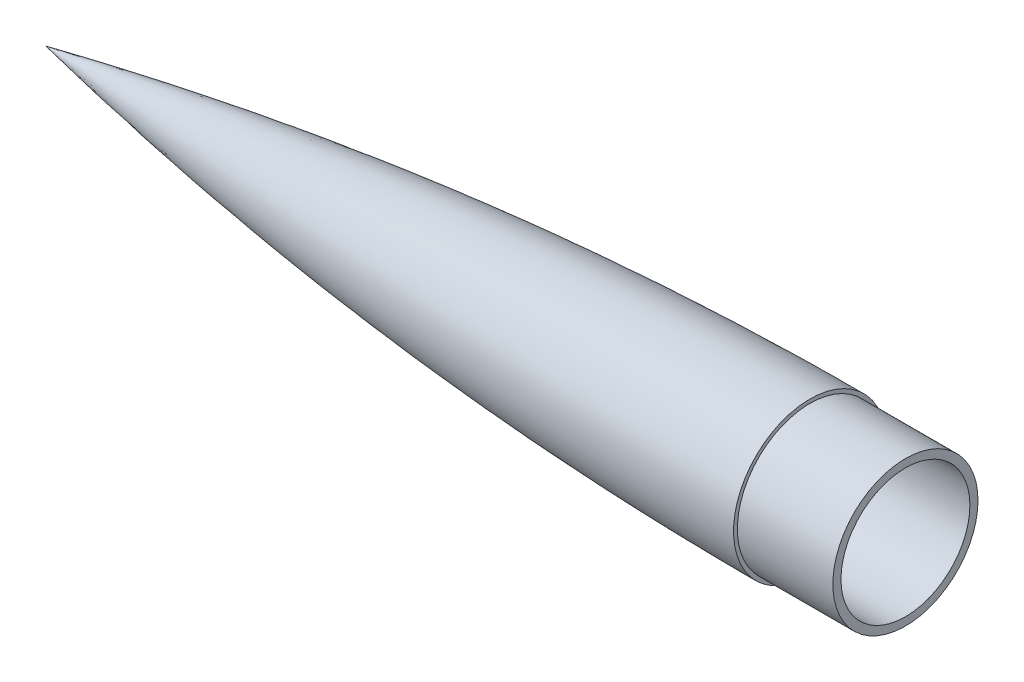
ISO-10303-21;
HEADER;
FILE_DESCRIPTION(('STEP AP214'),'2;1');
FILE_NAME('part.step','',(''),(''),'','','');
FILE_SCHEMA(('AUTOMOTIVE_DESIGN { 1 0 10303 214 1 1 1 1 }'));
ENDSEC;
DATA;
#1=APPLICATION_CONTEXT('core data for automotive mechanical design processes');
#2=APPLICATION_PROTOCOL_DEFINITION('international standard','automotive_design',2000,#1);
#3=PRODUCT_CONTEXT('',#1,'mechanical');
#4=PRODUCT('Part','Part','',(#3));
#5=PRODUCT_RELATED_PRODUCT_CATEGORY('part','',(#4));
#6=PRODUCT_DEFINITION_FORMATION('','',#4);
#7=PRODUCT_DEFINITION_CONTEXT('part definition',#1,'design');
#8=PRODUCT_DEFINITION('design','',#6,#7);
#9=PRODUCT_DEFINITION_SHAPE('','',#8);
#10=(LENGTH_UNIT() NAMED_UNIT(*) SI_UNIT(.MILLI.,.METRE.));
#11=(NAMED_UNIT(*) PLANE_ANGLE_UNIT() SI_UNIT($,.RADIAN.));
#12=(NAMED_UNIT(*) SI_UNIT($,.STERADIAN.) SOLID_ANGLE_UNIT());
#13=UNCERTAINTY_MEASURE_WITH_UNIT(LENGTH_MEASURE(1.E-05),#10,'distance_accuracy_value','');
#14=(GEOMETRIC_REPRESENTATION_CONTEXT(3) GLOBAL_UNCERTAINTY_ASSIGNED_CONTEXT((#13)) GLOBAL_UNIT_ASSIGNED_CONTEXT((#10,
#11,#12)) REPRESENTATION_CONTEXT('',''));
#15=CARTESIAN_POINT('',(0.,0.,0.));
#16=DIRECTION('',(0.,0.,1.));
#17=DIRECTION('',(1.,0.,0.));
#18=AXIS2_PLACEMENT_3D('',#15,#16,#17);
#19=CARTESIAN_POINT('',(-1.09778061314582E-13,1026.16,0.));
#20=DIRECTION('',(1.,0.,0.));
#21=DIRECTION('',(0.,0.,-1.));
#22=AXIS2_PLACEMENT_3D('',#19,#20,#21);
#23=PLANE('',#22);
#24=CARTESIAN_POINT('',(-1.11022302462516E-13,1005.84,0.));
#25=DIRECTION('',(1.,0.,0.));
#26=DIRECTION('',(0.,0.,-1.));
#27=AXIS2_PLACEMENT_3D('',#24,#25,#26);
#28=CIRCLE('',#27,20.3199999999999);
#29=CARTESIAN_POINT('',(-1.11022302462516E-13,1005.84,-20.3199999999999));
#30=VERTEX_POINT('',#29);
#31=EDGE_CURVE('E11',#30,#30,#28,.T.);
#32=ORIENTED_EDGE('',*,*,#31,.T.);
#33=EDGE_LOOP('',(#32));
#34=FACE_BOUND('',#33,.T.);
#35=CARTESIAN_POINT('',(-1.11022302462516E-13,1005.84,0.));
#36=DIRECTION('',(1.,0.,0.));
#37=DIRECTION('',(0.,0.,-1.));
#38=AXIS2_PLACEMENT_3D('',#35,#36,#37);
#39=CIRCLE('',#38,19.304);
#40=CARTESIAN_POINT('',(-1.11022302462516E-13,1005.84,-19.304));
#41=VERTEX_POINT('',#40);
#42=EDGE_CURVE('E43',#41,#41,#39,.F.);
#43=ORIENTED_EDGE('',*,*,#42,.T.);
#44=EDGE_LOOP('',(#43));
#45=FACE_BOUND('',#44,.T.);
#46=ADVANCED_FACE('F39',(#34,#45),#23,.T.);
#47=CARTESIAN_POINT('',(0.,1005.84,1005.84));
#48=DIRECTION('',(0.,-1.,0.));
#49=DIRECTION('',(0.,0.,-1.));
#50=AXIS2_PLACEMENT_3D('',#47,#48,#49);
#51=CIRCLE('',#50,1026.16);
#52=TRIMMED_CURVE('',#51,(PARAMETER_VALUE(-0.199337304982325)),
(PARAMETER_VALUE(0.199337304982325)),.T.,.PARAMETER.);
#53=CARTESIAN_POINT('',(0.,1005.84,0.));
#54=DIRECTION('',(1.,0.,0.));
#55=AXIS1_PLACEMENT('',#53,#54);
#56=SURFACE_OF_REVOLUTION('',#52,#55);
#57=CARTESIAN_POINT('',(-203.2,1005.84,0.));
#58=VERTEX_POINT('',#57);
#59=VERTEX_LOOP('',#58);
#60=FACE_BOUND('',#59,.T.);
#61=ORIENTED_EDGE('',*,*,#31,.F.);
#62=EDGE_LOOP('',(#61));
#63=FACE_BOUND('',#62,.T.);
#64=ADVANCED_FACE('F41',(#60,#63),#56,.T.);
#65=CARTESIAN_POINT('',(25.4,1005.84,0.));
#66=DIRECTION('',(1.,0.,0.));
#67=DIRECTION('',(0.,0.,-1.));
#68=AXIS2_PLACEMENT_3D('',#65,#66,#67);
#69=PLANE('',#68);
#70=CARTESIAN_POINT('',(25.4,1005.84,0.));
#71=DIRECTION('',(1.,0.,0.));
#72=DIRECTION('',(0.,0.,-1.));
#73=AXIS2_PLACEMENT_3D('',#70,#71,#72);
#74=CIRCLE('',#73,19.304);
#75=CARTESIAN_POINT('',(25.4,1005.84,-19.304));
#76=VERTEX_POINT('',#75);
#77=EDGE_CURVE('E64',#76,#76,#74,.T.);
#78=ORIENTED_EDGE('',*,*,#77,.T.);
#79=EDGE_LOOP('',(#78));
#80=FACE_BOUND('',#79,.T.);
#81=CARTESIAN_POINT('',(25.4,1005.84,0.));
#82=DIRECTION('',(1.,0.,0.));
#83=DIRECTION('',(0.,0.,-1.));
#84=AXIS2_PLACEMENT_3D('',#81,#82,#83);
#85=CIRCLE('',#84,17.1450000000002);
#86=CARTESIAN_POINT('',(25.4,1005.84,-17.1450000000002));
#87=VERTEX_POINT('',#86);
#88=EDGE_CURVE('E70',#87,#87,#85,.T.);
#89=ORIENTED_EDGE('',*,*,#88,.F.);
#90=EDGE_LOOP('',(#89));
#91=FACE_BOUND('',#90,.T.);
#92=ADVANCED_FACE('F78',(#80,#91),#69,.T.);
#93=CARTESIAN_POINT('',(25.4,1005.84,0.));
#94=DIRECTION('',(-1.,0.,0.));
#95=DIRECTION('',(0.,0.,1.));
#96=AXIS2_PLACEMENT_3D('',#93,#94,#95);
#97=CYLINDRICAL_SURFACE('',#96,19.304);
#98=ORIENTED_EDGE('',*,*,#42,.F.);
#99=EDGE_LOOP('',(#98));
#100=FACE_BOUND('',#99,.T.);
#101=ORIENTED_EDGE('',*,*,#77,.F.);
#102=EDGE_LOOP('',(#101));
#103=FACE_BOUND('',#102,.T.);
#104=ADVANCED_FACE('F80',(#100,#103),#97,.T.);
#105=CARTESIAN_POINT('',(25.4,1005.84,0.));
#106=DIRECTION('',(-1.,0.,0.));
#107=DIRECTION('',(0.,0.,1.));
#108=AXIS2_PLACEMENT_3D('',#105,#106,#107);
#109=CYLINDRICAL_SURFACE('',#108,17.1450000000002);
#110=CARTESIAN_POINT('',(0.,1005.84,0.));
#111=DIRECTION('',(-1.,0.,0.));
#112=DIRECTION('',(0.,0.,1.));
#113=AXIS2_PLACEMENT_3D('',#110,#111,#112);
#114=CIRCLE('',#113,17.1450000000002);
#115=CARTESIAN_POINT('',(0.,1005.84,17.1450000000002));
#116=VERTEX_POINT('',#115);
#117=EDGE_CURVE('E61',#116,#116,#114,.T.);
#118=ORIENTED_EDGE('',*,*,#117,.T.);
#119=EDGE_LOOP('',(#118));
#120=FACE_BOUND('',#119,.T.);
#121=ORIENTED_EDGE('',*,*,#88,.T.);
#122=EDGE_LOOP('',(#121));
#123=FACE_BOUND('',#122,.T.);
#124=ADVANCED_FACE('F57',(#120,#123),#109,.F.);
#125=CARTESIAN_POINT('',(0.,1005.84,1005.84));
#126=DIRECTION('',(0.,-1.,0.));
#127=DIRECTION('',(0.,0.,-1.));
#128=AXIS2_PLACEMENT_3D('',#125,#126,#127);
#129=CIRCLE('',#128,1022.985);
#130=TRIMMED_CURVE('',#129,(PARAMETER_VALUE(-0.183340131545685)),
(PARAMETER_VALUE(0.183340131545685)),.T.,.PARAMETER.);
#131=CARTESIAN_POINT('',(0.,1005.84,0.));
#132=DIRECTION('',(1.,0.,0.));
#133=AXIS1_PLACEMENT('',#131,#132);
#134=SURFACE_OF_REVOLUTION('',#130,#133);
#135=CARTESIAN_POINT('',(-186.505240207883,1005.84,0.));
#136=VERTEX_POINT('',#135);
#137=VERTEX_LOOP('',#136);
#138=FACE_BOUND('',#137,.T.);
#139=ORIENTED_EDGE('',*,*,#117,.F.);
#140=EDGE_LOOP('',(#139));
#141=FACE_BOUND('',#140,.T.);
#142=ADVANCED_FACE('F54',(#138,#141),#134,.F.);
#143=CLOSED_SHELL('',(#46,#64,#92,#104,#124,#142));
#144=MANIFOLD_SOLID_BREP('B2',#143);
#145=ADVANCED_BREP_SHAPE_REPRESENTATION('',(#18,#144),#14);
#146=SHAPE_DEFINITION_REPRESENTATION(#9,#145);
ENDSEC;
END-ISO-10303-21;
